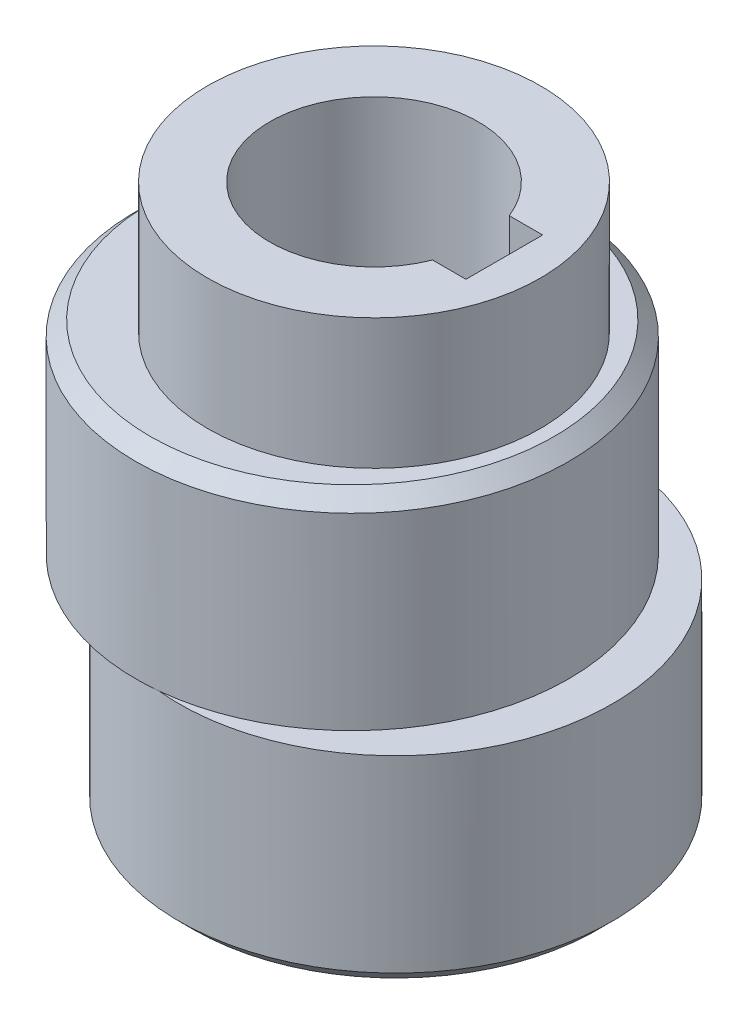
ISO-10303-21;
HEADER;
FILE_DESCRIPTION(('STEP AP214'),'2;1');
FILE_NAME('part.step','',(''),(''),'','','');
FILE_SCHEMA(('AUTOMOTIVE_DESIGN { 1 0 10303 214 1 1 1 1 }'));
ENDSEC;
DATA;
#1=APPLICATION_CONTEXT('core data for automotive mechanical design processes');
#2=APPLICATION_PROTOCOL_DEFINITION('international standard','automotive_design',2000,#1);
#3=PRODUCT_CONTEXT('',#1,'mechanical');
#4=PRODUCT('Part','Part','',(#3));
#5=PRODUCT_RELATED_PRODUCT_CATEGORY('part','',(#4));
#6=PRODUCT_DEFINITION_FORMATION('','',#4);
#7=PRODUCT_DEFINITION_CONTEXT('part definition',#1,'design');
#8=PRODUCT_DEFINITION('design','',#6,#7);
#9=PRODUCT_DEFINITION_SHAPE('','',#8);
#10=(LENGTH_UNIT() NAMED_UNIT(*) SI_UNIT(.MILLI.,.METRE.));
#11=(NAMED_UNIT(*) PLANE_ANGLE_UNIT() SI_UNIT($,.RADIAN.));
#12=(NAMED_UNIT(*) SI_UNIT($,.STERADIAN.) SOLID_ANGLE_UNIT());
#13=UNCERTAINTY_MEASURE_WITH_UNIT(LENGTH_MEASURE(1.E-05),#10,'distance_accuracy_value','');
#14=(GEOMETRIC_REPRESENTATION_CONTEXT(3) GLOBAL_UNCERTAINTY_ASSIGNED_CONTEXT((#13)) GLOBAL_UNIT_ASSIGNED_CONTEXT((#10,
#11,#12)) REPRESENTATION_CONTEXT('',''));
#15=CARTESIAN_POINT('',(0.,0.,0.));
#16=DIRECTION('',(0.,0.,1.));
#17=DIRECTION('',(1.,0.,0.));
#18=AXIS2_PLACEMENT_3D('',#15,#16,#17);
#19=CARTESIAN_POINT('',(0.,14.,0.));
#20=DIRECTION('',(0.,-1.,0.));
#21=DIRECTION('',(0.,0.,-1.));
#22=AXIS2_PLACEMENT_3D('',#19,#20,#21);
#23=CYLINDRICAL_SURFACE('',#22,14.95);
#24=CARTESIAN_POINT('',(0.,13.,0.));
#25=DIRECTION('',(0.,1.,0.));
#26=DIRECTION('',(0.,0.,1.));
#27=AXIS2_PLACEMENT_3D('',#24,#25,#26);
#28=CIRCLE('',#27,14.95);
#29=CARTESIAN_POINT('',(0.,13.,14.95));
#30=VERTEX_POINT('',#29);
#31=EDGE_CURVE('E122',#30,#30,#28,.F.);
#32=ORIENTED_EDGE('',*,*,#31,.T.);
#33=EDGE_LOOP('',(#32));
#34=FACE_BOUND('',#33,.T.);
#35=CARTESIAN_POINT('',(0.,0.,0.));
#36=DIRECTION('',(0.,1.,0.));
#37=DIRECTION('',(0.,0.,1.));
#38=AXIS2_PLACEMENT_3D('',#35,#36,#37);
#39=CIRCLE('',#38,14.95);
#40=CARTESIAN_POINT('',(1.49999999999999,0.,14.8745588169868));
#41=VERTEX_POINT('',#40);
#42=CARTESIAN_POINT('',(1.49999999999999,0.,-14.8745588169868));
#43=VERTEX_POINT('',#42);
#44=EDGE_CURVE('E125',#41,#43,#39,.T.);
#45=ORIENTED_EDGE('',*,*,#44,.T.);
#46=EDGE_CURVE('E124',#43,#41,#39,.T.);
#47=ORIENTED_EDGE('',*,*,#46,.T.);
#48=EDGE_LOOP('',(#45,#47));
#49=FACE_BOUND('',#48,.T.);
#50=ADVANCED_FACE('F32',(#34,#49),#23,.T.);
#51=CARTESIAN_POINT('',(0.,14.,0.));
#52=DIRECTION('',(0.,1.,0.));
#53=DIRECTION('',(0.,0.,1.));
#54=AXIS2_PLACEMENT_3D('',#51,#52,#53);
#55=PLANE('',#54);
#56=CARTESIAN_POINT('',(1.5,14.,0.));
#57=DIRECTION('',(0.,1.,0.));
#58=DIRECTION('',(0.,0.,1.));
#59=AXIS2_PLACEMENT_3D('',#56,#57,#58);
#60=CIRCLE('',#59,11.5);
#61=CARTESIAN_POINT('',(1.5,14.,11.5));
#62=VERTEX_POINT('',#61);
#63=EDGE_CURVE('E119',#62,#62,#60,.T.);
#64=ORIENTED_EDGE('',*,*,#63,.F.);
#65=EDGE_LOOP('',(#64));
#66=FACE_BOUND('',#65,.T.);
#67=CARTESIAN_POINT('',(0.,14.,0.));
#68=DIRECTION('',(0.,1.,0.));
#69=DIRECTION('',(0.,0.,1.));
#70=AXIS2_PLACEMENT_3D('',#67,#68,#69);
#71=CIRCLE('',#70,13.95);
#72=CARTESIAN_POINT('',(0.,14.,13.95));
#73=VERTEX_POINT('',#72);
#74=EDGE_CURVE('E133',#73,#73,#71,.T.);
#75=ORIENTED_EDGE('',*,*,#74,.T.);
#76=EDGE_LOOP('',(#75));
#77=FACE_BOUND('',#76,.T.);
#78=ADVANCED_FACE('F165',(#66,#77),#55,.T.);
#79=CARTESIAN_POINT('',(0.,0.,0.));
#80=DIRECTION('',(0.,1.,0.));
#81=DIRECTION('',(0.,0.,1.));
#82=AXIS2_PLACEMENT_3D('',#79,#80,#81);
#83=PLANE('',#82);
#84=CARTESIAN_POINT('',(3.,0.,0.));
#85=DIRECTION('',(0.,-1.,0.));
#86=DIRECTION('',(0.,0.,-1.));
#87=AXIS2_PLACEMENT_3D('',#84,#85,#86);
#88=CIRCLE('',#87,14.95);
#89=EDGE_CURVE('E54',#41,#43,#88,.T.);
#90=ORIENTED_EDGE('',*,*,#89,.F.);
#91=ORIENTED_EDGE('',*,*,#46,.F.);
#92=EDGE_LOOP('',(#90,#91));
#93=FACE_BOUND('',#92,.T.);
#94=ADVANCED_FACE('F170',(#93),#83,.F.);
#95=CARTESIAN_POINT('',(3.,-14.,0.));
#96=DIRECTION('',(0.,1.,0.));
#97=DIRECTION('',(0.,0.,1.));
#98=AXIS2_PLACEMENT_3D('',#95,#96,#97);
#99=CYLINDRICAL_SURFACE('',#98,14.95);
#100=CARTESIAN_POINT('',(3.,-13.,0.));
#101=DIRECTION('',(0.,-1.,0.));
#102=DIRECTION('',(0.,0.,-1.));
#103=AXIS2_PLACEMENT_3D('',#100,#101,#102);
#104=CIRCLE('',#103,14.95);
#105=CARTESIAN_POINT('',(3.,-13.,-14.95));
#106=VERTEX_POINT('',#105);
#107=EDGE_CURVE('E130',#106,#106,#104,.F.);
#108=ORIENTED_EDGE('',*,*,#107,.T.);
#109=EDGE_LOOP('',(#108));
#110=FACE_BOUND('',#109,.T.);
#111=ORIENTED_EDGE('',*,*,#89,.T.);
#112=EDGE_CURVE('E118',#43,#41,#88,.T.);
#113=ORIENTED_EDGE('',*,*,#112,.T.);
#114=EDGE_LOOP('',(#111,#113));
#115=FACE_BOUND('',#114,.T.);
#116=ADVANCED_FACE('F147',(#110,#115),#99,.T.);
#117=CARTESIAN_POINT('',(3.,-14.,0.));
#118=DIRECTION('',(0.,-1.,0.));
#119=DIRECTION('',(0.,0.,-1.));
#120=AXIS2_PLACEMENT_3D('',#117,#118,#119);
#121=PLANE('',#120);
#122=DIRECTION('',(1.,0.,0.));
#123=VECTOR('',#122,1.);
#124=CARTESIAN_POINT('',(10.5,-14.,2.65));
#125=LINE('',#124,#123);
#126=CARTESIAN_POINT('',(8.1945873659248,-14.,2.65));
#127=VERTEX_POINT('',#126);
#128=CARTESIAN_POINT('',(10.5,-14.,2.65));
#129=VERTEX_POINT('',#128);
#130=EDGE_CURVE('E102',#127,#129,#125,.T.);
#131=ORIENTED_EDGE('',*,*,#130,.T.);
#132=DIRECTION('',(0.,0.,-1.));
#133=VECTOR('',#132,1.);
#134=CARTESIAN_POINT('',(10.5,-14.,-2.65));
#135=LINE('',#134,#133);
#136=CARTESIAN_POINT('',(10.5,-14.,-2.65));
#137=VERTEX_POINT('',#136);
#138=EDGE_CURVE('E94',#129,#137,#135,.T.);
#139=ORIENTED_EDGE('',*,*,#138,.T.);
#140=DIRECTION('',(-1.,0.,0.));
#141=VECTOR('',#140,1.);
#142=CARTESIAN_POINT('',(7.78176397856864,-14.,-2.65));
#143=LINE('',#142,#141);
#144=CARTESIAN_POINT('',(8.1945873659248,-14.,-2.65));
#145=VERTEX_POINT('',#144);
#146=EDGE_CURVE('E97',#137,#145,#143,.T.);
#147=ORIENTED_EDGE('',*,*,#146,.T.);
#148=CARTESIAN_POINT('',(1.5,-14.,0.));
#149=DIRECTION('',(0.,1.,0.));
#150=DIRECTION('',(0.,0.,1.));
#151=AXIS2_PLACEMENT_3D('',#148,#149,#150);
#152=CIRCLE('',#151,7.2);
#153=EDGE_CURVE('E112',#145,#127,#152,.T.);
#154=ORIENTED_EDGE('',*,*,#153,.T.);
#155=EDGE_LOOP('',(#131,#139,#147,#154));
#156=FACE_BOUND('',#155,.T.);
#157=CARTESIAN_POINT('',(3.,-14.,0.));
#158=DIRECTION('',(0.,-1.,0.));
#159=DIRECTION('',(0.,0.,-1.));
#160=AXIS2_PLACEMENT_3D('',#157,#158,#159);
#161=CIRCLE('',#160,13.95);
#162=CARTESIAN_POINT('',(3.,-14.,-13.95));
#163=VERTEX_POINT('',#162);
#164=EDGE_CURVE('E127',#163,#163,#161,.T.);
#165=ORIENTED_EDGE('',*,*,#164,.T.);
#166=EDGE_LOOP('',(#165));
#167=FACE_BOUND('',#166,.T.);
#168=ADVANCED_FACE('F143',(#156,#167),#121,.T.);
#169=CARTESIAN_POINT('',(3.,0.,0.));
#170=DIRECTION('',(0.,-1.,0.));
#171=DIRECTION('',(0.,0.,-1.));
#172=AXIS2_PLACEMENT_3D('',#169,#170,#171);
#173=PLANE('',#172);
#174=ORIENTED_EDGE('',*,*,#44,.F.);
#175=ORIENTED_EDGE('',*,*,#112,.F.);
#176=EDGE_LOOP('',(#174,#175));
#177=FACE_BOUND('',#176,.T.);
#178=ADVANCED_FACE('F146',(#177),#173,.F.);
#179=CARTESIAN_POINT('',(3.,-14.,0.));
#180=DIRECTION('',(0.,1.,0.));
#181=DIRECTION('',(0.,0.,1.));
#182=AXIS2_PLACEMENT_3D('',#179,#180,#181);
#183=CONICAL_SURFACE('',#182,13.95,0.785398163397447);
#184=ORIENTED_EDGE('',*,*,#107,.F.);
#185=EDGE_LOOP('',(#184));
#186=FACE_BOUND('',#185,.T.);
#187=ORIENTED_EDGE('',*,*,#164,.F.);
#188=EDGE_LOOP('',(#187));
#189=FACE_BOUND('',#188,.T.);
#190=ADVANCED_FACE('F151',(#186,#189),#183,.T.);
#191=CARTESIAN_POINT('',(0.,14.,0.));
#192=DIRECTION('',(0.,-1.,0.));
#193=DIRECTION('',(0.,0.,-1.));
#194=AXIS2_PLACEMENT_3D('',#191,#192,#193);
#195=CONICAL_SURFACE('',#194,13.95,0.785398163397447);
#196=ORIENTED_EDGE('',*,*,#31,.F.);
#197=EDGE_LOOP('',(#196));
#198=FACE_BOUND('',#197,.T.);
#199=ORIENTED_EDGE('',*,*,#74,.F.);
#200=EDGE_LOOP('',(#199));
#201=FACE_BOUND('',#200,.T.);
#202=ADVANCED_FACE('F34',(#198,#201),#195,.T.);
#203=CARTESIAN_POINT('',(1.5,23.,0.));
#204=DIRECTION('',(0.,-1.,0.));
#205=DIRECTION('',(0.,0.,-1.));
#206=AXIS2_PLACEMENT_3D('',#203,#204,#205);
#207=CYLINDRICAL_SURFACE('',#206,11.5);
#208=CARTESIAN_POINT('',(1.5,23.,0.));
#209=DIRECTION('',(0.,1.,0.));
#210=DIRECTION('',(0.,0.,1.));
#211=AXIS2_PLACEMENT_3D('',#208,#209,#210);
#212=CIRCLE('',#211,11.5);
#213=CARTESIAN_POINT('',(1.5,23.,11.5));
#214=VERTEX_POINT('',#213);
#215=EDGE_CURVE('E115',#214,#214,#212,.T.);
#216=ORIENTED_EDGE('',*,*,#215,.F.);
#217=EDGE_LOOP('',(#216));
#218=FACE_BOUND('',#217,.T.);
#219=ORIENTED_EDGE('',*,*,#63,.T.);
#220=EDGE_LOOP('',(#219));
#221=FACE_BOUND('',#220,.T.);
#222=ADVANCED_FACE('F158',(#218,#221),#207,.T.);
#223=CARTESIAN_POINT('',(1.5,23.,0.));
#224=DIRECTION('',(0.,1.,0.));
#225=DIRECTION('',(0.,0.,1.));
#226=AXIS2_PLACEMENT_3D('',#223,#224,#225);
#227=PLANE('',#226);
#228=DIRECTION('',(1.,0.,0.));
#229=VECTOR('',#228,1.);
#230=CARTESIAN_POINT('',(10.5,23.,2.65));
#231=LINE('',#230,#229);
#232=CARTESIAN_POINT('',(8.1945873659248,23.,2.65));
#233=VERTEX_POINT('',#232);
#234=CARTESIAN_POINT('',(10.5,23.,2.65));
#235=VERTEX_POINT('',#234);
#236=EDGE_CURVE('E79',#233,#235,#231,.T.);
#237=ORIENTED_EDGE('',*,*,#236,.F.);
#238=CARTESIAN_POINT('',(1.5,23.,0.));
#239=DIRECTION('',(0.,1.,0.));
#240=DIRECTION('',(0.,0.,1.));
#241=AXIS2_PLACEMENT_3D('',#238,#239,#240);
#242=CIRCLE('',#241,7.2);
#243=CARTESIAN_POINT('',(8.1945873659248,23.,-2.65));
#244=VERTEX_POINT('',#243);
#245=EDGE_CURVE('E109',#244,#233,#242,.T.);
#246=ORIENTED_EDGE('',*,*,#245,.F.);
#247=DIRECTION('',(-1.,0.,0.));
#248=VECTOR('',#247,1.);
#249=CARTESIAN_POINT('',(7.78176397856864,23.,-2.65));
#250=LINE('',#249,#248);
#251=CARTESIAN_POINT('',(10.5,23.,-2.65));
#252=VERTEX_POINT('',#251);
#253=EDGE_CURVE('E47',#252,#244,#250,.T.);
#254=ORIENTED_EDGE('',*,*,#253,.F.);
#255=DIRECTION('',(0.,0.,-1.));
#256=VECTOR('',#255,1.);
#257=CARTESIAN_POINT('',(10.5,23.,-2.65));
#258=LINE('',#257,#256);
#259=EDGE_CURVE('E88',#235,#252,#258,.T.);
#260=ORIENTED_EDGE('',*,*,#259,.F.);
#261=EDGE_LOOP('',(#237,#246,#254,#260));
#262=FACE_BOUND('',#261,.T.);
#263=ORIENTED_EDGE('',*,*,#215,.T.);
#264=EDGE_LOOP('',(#263));
#265=FACE_BOUND('',#264,.T.);
#266=ADVANCED_FACE('F99',(#262,#265),#227,.T.);
#267=CARTESIAN_POINT('',(1.5,-14.,0.));
#268=DIRECTION('',(0.,1.,0.));
#269=DIRECTION('',(0.,0.,1.));
#270=AXIS2_PLACEMENT_3D('',#267,#268,#269);
#271=CYLINDRICAL_SURFACE('',#270,7.2);
#272=ORIENTED_EDGE('',*,*,#245,.T.);
#273=DIRECTION('',(0.,1.,0.));
#274=VECTOR('',#273,1.);
#275=CARTESIAN_POINT('',(8.1945873659248,-14.,2.65));
#276=LINE('',#275,#274);
#277=EDGE_CURVE('E11',#233,#127,#276,.F.);
#278=ORIENTED_EDGE('',*,*,#277,.T.);
#279=ORIENTED_EDGE('',*,*,#153,.F.);
#280=DIRECTION('',(0.,1.,0.));
#281=VECTOR('',#280,1.);
#282=CARTESIAN_POINT('',(8.1945873659248,-14.,-2.65));
#283=LINE('',#282,#281);
#284=EDGE_CURVE('E40',#145,#244,#283,.T.);
#285=ORIENTED_EDGE('',*,*,#284,.T.);
#286=EDGE_LOOP('',(#272,#278,#279,#285));
#287=FACE_BOUND('',#286,.T.);
#288=ADVANCED_FACE('F139',(#287),#271,.F.);
#289=CARTESIAN_POINT('',(10.5,-14.,2.65));
#290=DIRECTION('',(0.,0.,1.));
#291=DIRECTION('',(1.,0.,0.));
#292=AXIS2_PLACEMENT_3D('',#289,#290,#291);
#293=PLANE('',#292);
#294=ORIENTED_EDGE('',*,*,#236,.T.);
#295=DIRECTION('',(0.,1.,0.));
#296=VECTOR('',#295,1.);
#297=CARTESIAN_POINT('',(10.5,-14.,2.65));
#298=LINE('',#297,#296);
#299=EDGE_CURVE('E82',#129,#235,#298,.T.);
#300=ORIENTED_EDGE('',*,*,#299,.F.);
#301=ORIENTED_EDGE('',*,*,#130,.F.);
#302=ORIENTED_EDGE('',*,*,#277,.F.);
#303=EDGE_LOOP('',(#294,#300,#301,#302));
#304=FACE_BOUND('',#303,.T.);
#305=ADVANCED_FACE('F81',(#304),#293,.F.);
#306=CARTESIAN_POINT('',(7.78176397856864,-14.,-2.65));
#307=DIRECTION('',(0.,0.,-1.));
#308=DIRECTION('',(-1.,0.,0.));
#309=AXIS2_PLACEMENT_3D('',#306,#307,#308);
#310=PLANE('',#309);
#311=ORIENTED_EDGE('',*,*,#146,.F.);
#312=DIRECTION('',(0.,1.,0.));
#313=VECTOR('',#312,1.);
#314=CARTESIAN_POINT('',(10.5,-14.,-2.65));
#315=LINE('',#314,#313);
#316=EDGE_CURVE('E96',#137,#252,#315,.T.);
#317=ORIENTED_EDGE('',*,*,#316,.T.);
#318=ORIENTED_EDGE('',*,*,#253,.T.);
#319=ORIENTED_EDGE('',*,*,#284,.F.);
#320=EDGE_LOOP('',(#311,#317,#318,#319));
#321=FACE_BOUND('',#320,.T.);
#322=ADVANCED_FACE('F141',(#321),#310,.F.);
#323=CARTESIAN_POINT('',(10.5,-14.,-2.65));
#324=DIRECTION('',(1.,0.,0.));
#325=DIRECTION('',(0.,0.,-1.));
#326=AXIS2_PLACEMENT_3D('',#323,#324,#325);
#327=PLANE('',#326);
#328=ORIENTED_EDGE('',*,*,#316,.F.);
#329=ORIENTED_EDGE('',*,*,#138,.F.);
#330=ORIENTED_EDGE('',*,*,#299,.T.);
#331=ORIENTED_EDGE('',*,*,#259,.T.);
#332=EDGE_LOOP('',(#328,#329,#330,#331));
#333=FACE_BOUND('',#332,.T.);
#334=ADVANCED_FACE('F92',(#333),#327,.F.);
#335=CLOSED_SHELL('',(#50,#78,#94,#116,#168,#178,#190,#202,#222,#266,#288,#305,#322,#334));
#336=MANIFOLD_SOLID_BREP('B2',#335);
#337=ADVANCED_BREP_SHAPE_REPRESENTATION('',(#18,#336),#14);
#338=SHAPE_DEFINITION_REPRESENTATION(#9,#337);
ENDSEC;
END-ISO-10303-21;
